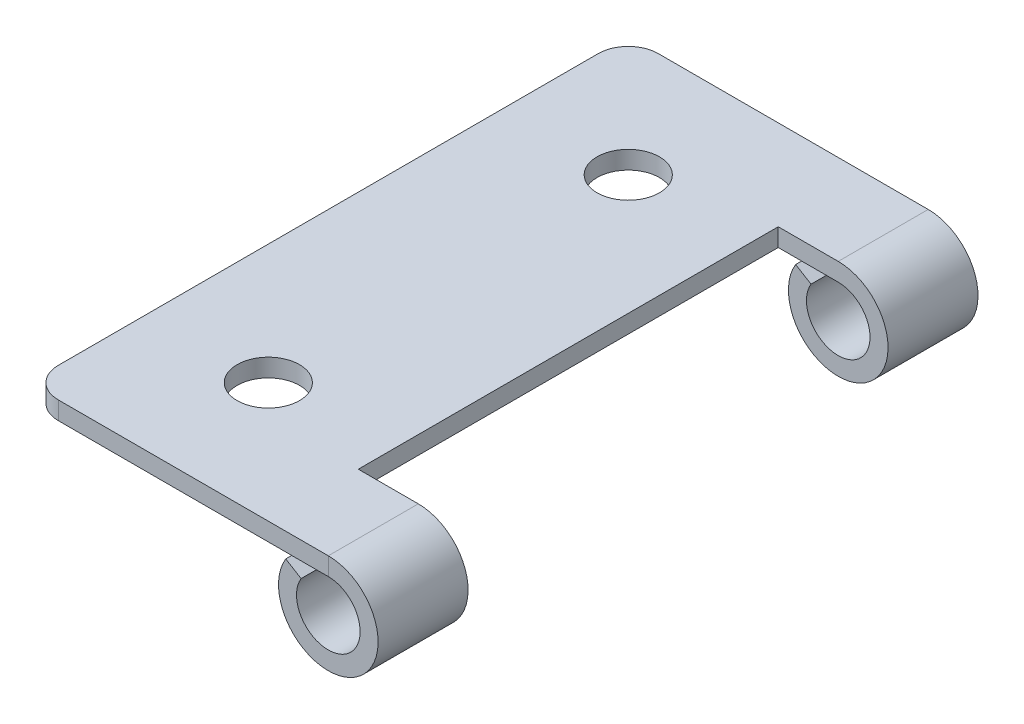
ISO-10303-21;
HEADER;
FILE_DESCRIPTION(('STEP AP214'),'2;1');
FILE_NAME('part.step','',(''),(''),'','','');
FILE_SCHEMA(('AUTOMOTIVE_DESIGN { 1 0 10303 214 1 1 1 1 }'));
ENDSEC;
DATA;
#1=APPLICATION_CONTEXT('core data for automotive mechanical design processes');
#2=APPLICATION_PROTOCOL_DEFINITION('international standard','automotive_design',2000,#1);
#3=PRODUCT_CONTEXT('',#1,'mechanical');
#4=PRODUCT('Part','Part','',(#3));
#5=PRODUCT_RELATED_PRODUCT_CATEGORY('part','',(#4));
#6=PRODUCT_DEFINITION_FORMATION('','',#4);
#7=PRODUCT_DEFINITION_CONTEXT('part definition',#1,'design');
#8=PRODUCT_DEFINITION('design','',#6,#7);
#9=PRODUCT_DEFINITION_SHAPE('','',#8);
#10=(LENGTH_UNIT() NAMED_UNIT(*) SI_UNIT(.MILLI.,.METRE.));
#11=(NAMED_UNIT(*) PLANE_ANGLE_UNIT() SI_UNIT($,.RADIAN.));
#12=(NAMED_UNIT(*) SI_UNIT($,.STERADIAN.) SOLID_ANGLE_UNIT());
#13=UNCERTAINTY_MEASURE_WITH_UNIT(LENGTH_MEASURE(1.E-05),#10,'distance_accuracy_value','');
#14=(GEOMETRIC_REPRESENTATION_CONTEXT(3) GLOBAL_UNCERTAINTY_ASSIGNED_CONTEXT((#13)) GLOBAL_UNIT_ASSIGNED_CONTEXT((#10,
#11,#12)) REPRESENTATION_CONTEXT('',''));
#15=CARTESIAN_POINT('',(0.,0.,0.));
#16=DIRECTION('',(0.,0.,1.));
#17=DIRECTION('',(1.,0.,0.));
#18=AXIS2_PLACEMENT_3D('',#15,#16,#17);
#19=CARTESIAN_POINT('',(12.5,-4.15,25.));
#20=DIRECTION('',(0.,0.,-1.));
#21=DIRECTION('',(-1.,0.,0.));
#22=AXIS2_PLACEMENT_3D('',#19,#20,#21);
#23=CYLINDRICAL_SURFACE('',#22,2.65);
#24=DIRECTION('',(0.,0.,-1.));
#25=VECTOR('',#24,1.);
#26=CARTESIAN_POINT('',(12.5,-1.5,25.));
#27=LINE('',#26,#25);
#28=CARTESIAN_POINT('',(12.5,-1.5,25.));
#29=VERTEX_POINT('',#28);
#30=CARTESIAN_POINT('',(12.5,-1.5,17.5));
#31=VERTEX_POINT('',#30);
#32=EDGE_CURVE('E211',#29,#31,#27,.T.);
#33=ORIENTED_EDGE('',*,*,#32,.T.);
#34=CARTESIAN_POINT('',(12.5,-4.15,17.5));
#35=DIRECTION('',(0.,0.,1.));
#36=DIRECTION('',(1.,0.,0.));
#37=AXIS2_PLACEMENT_3D('',#34,#35,#36);
#38=CIRCLE('',#37,2.65);
#39=CARTESIAN_POINT('',(10.2333573843064,-2.77710843373494,17.5));
#40=VERTEX_POINT('',#39);
#41=EDGE_CURVE('E178',#31,#40,#38,.F.);
#42=ORIENTED_EDGE('',*,*,#41,.T.);
#43=DIRECTION('',(0.,0.,-1.));
#44=VECTOR('',#43,1.);
#45=CARTESIAN_POINT('',(10.2333573843064,-2.77710843373494,25.));
#46=LINE('',#45,#44);
#47=CARTESIAN_POINT('',(10.2333573843064,-2.77710843373494,25.));
#48=VERTEX_POINT('',#47);
#49=EDGE_CURVE('E226',#48,#40,#46,.T.);
#50=ORIENTED_EDGE('',*,*,#49,.F.);
#51=CARTESIAN_POINT('',(12.5,-4.15,25.));
#52=DIRECTION('',(0.,0.,1.));
#53=DIRECTION('',(1.,0.,0.));
#54=AXIS2_PLACEMENT_3D('',#51,#52,#53);
#55=CIRCLE('',#54,2.65);
#56=EDGE_CURVE('E186',#29,#48,#55,.F.);
#57=ORIENTED_EDGE('',*,*,#56,.F.);
#58=EDGE_LOOP('',(#33,#42,#50,#57));
#59=FACE_BOUND('',#58,.T.);
#60=ADVANCED_FACE('F38',(#59),#23,.F.);
#61=CARTESIAN_POINT('',(8.95035213014023,-2.,25.));
#62=DIRECTION('',(0.518072289156626,0.855336836110788,0.));
#63=DIRECTION('',(-0.855336836110788,0.518072289156627,0.));
#64=AXIS2_PLACEMENT_3D('',#61,#62,#63);
#65=PLANE('',#64);
#66=DIRECTION('',(0.855336836110788,-0.518072289156627,0.));
#67=VECTOR('',#66,1.);
#68=CARTESIAN_POINT('',(8.95035213014023,-2.,17.5));
#69=LINE('',#68,#67);
#70=CARTESIAN_POINT('',(8.95035213014023,-2.,17.5));
#71=VERTEX_POINT('',#70);
#72=EDGE_CURVE('E181',#71,#40,#69,.T.);
#73=ORIENTED_EDGE('',*,*,#72,.F.);
#74=DIRECTION('',(0.,0.,-1.));
#75=VECTOR('',#74,1.);
#76=CARTESIAN_POINT('',(8.95035213014023,-2.,25.));
#77=LINE('',#76,#75);
#78=CARTESIAN_POINT('',(8.95035213014023,-2.,25.));
#79=VERTEX_POINT('',#78);
#80=EDGE_CURVE('E222',#79,#71,#77,.T.);
#81=ORIENTED_EDGE('',*,*,#80,.F.);
#82=DIRECTION('',(0.855336836110788,-0.518072289156627,0.));
#83=VECTOR('',#82,1.);
#84=CARTESIAN_POINT('',(8.95035213014023,-2.,25.));
#85=LINE('',#84,#83);
#86=EDGE_CURVE('E188',#79,#48,#85,.T.);
#87=ORIENTED_EDGE('',*,*,#86,.T.);
#88=ORIENTED_EDGE('',*,*,#49,.T.);
#89=EDGE_LOOP('',(#73,#81,#87,#88));
#90=FACE_BOUND('',#89,.T.);
#91=ADVANCED_FACE('F293',(#90),#65,.T.);
#92=CARTESIAN_POINT('',(12.5,-4.15,25.));
#93=DIRECTION('',(0.,0.,-1.));
#94=DIRECTION('',(-1.,0.,0.));
#95=AXIS2_PLACEMENT_3D('',#92,#93,#94);
#96=CYLINDRICAL_SURFACE('',#95,4.15);
#97=ORIENTED_EDGE('',*,*,#80,.T.);
#98=CARTESIAN_POINT('',(12.5,-4.15,17.5));
#99=DIRECTION('',(0.,0.,1.));
#100=DIRECTION('',(1.,0.,0.));
#101=AXIS2_PLACEMENT_3D('',#98,#99,#100);
#102=CIRCLE('',#101,4.15);
#103=CARTESIAN_POINT('',(12.5,0.,17.5));
#104=VERTEX_POINT('',#103);
#105=EDGE_CURVE('E183',#104,#71,#102,.F.);
#106=ORIENTED_EDGE('',*,*,#105,.F.);
#107=DIRECTION('',(0.,0.,-1.));
#108=VECTOR('',#107,1.);
#109=CARTESIAN_POINT('',(12.5,0.,25.));
#110=LINE('',#109,#108);
#111=CARTESIAN_POINT('',(12.5,0.,25.));
#112=VERTEX_POINT('',#111);
#113=EDGE_CURVE('E219',#112,#104,#110,.T.);
#114=ORIENTED_EDGE('',*,*,#113,.F.);
#115=CARTESIAN_POINT('',(12.5,-4.15,25.));
#116=DIRECTION('',(0.,0.,-1.));
#117=DIRECTION('',(-1.,0.,0.));
#118=AXIS2_PLACEMENT_3D('',#115,#116,#117);
#119=CIRCLE('',#118,4.15);
#120=EDGE_CURVE('E192',#112,#79,#119,.T.);
#121=ORIENTED_EDGE('',*,*,#120,.T.);
#122=EDGE_LOOP('',(#97,#106,#114,#121));
#123=FACE_BOUND('',#122,.T.);
#124=ADVANCED_FACE('F286',(#123),#96,.T.);
#125=CARTESIAN_POINT('',(12.5,-1.5,25.));
#126=DIRECTION('',(0.,0.,1.));
#127=DIRECTION('',(1.,0.,0.));
#128=AXIS2_PLACEMENT_3D('',#125,#126,#127);
#129=PLANE('',#128);
#130=DIRECTION('',(0.,1.,0.));
#131=VECTOR('',#130,1.);
#132=CARTESIAN_POINT('',(12.5,-1.5,25.));
#133=LINE('',#132,#131);
#134=EDGE_CURVE('E232',#29,#112,#133,.T.);
#135=ORIENTED_EDGE('',*,*,#134,.F.);
#136=ORIENTED_EDGE('',*,*,#56,.T.);
#137=ORIENTED_EDGE('',*,*,#86,.F.);
#138=ORIENTED_EDGE('',*,*,#120,.F.);
#139=EDGE_LOOP('',(#135,#136,#137,#138));
#140=FACE_BOUND('',#139,.T.);
#141=ADVANCED_FACE('F288',(#140),#129,.T.);
#142=CARTESIAN_POINT('',(12.5,0.,-25.));
#143=DIRECTION('',(0.,0.,-1.));
#144=DIRECTION('',(-1.,0.,0.));
#145=AXIS2_PLACEMENT_3D('',#142,#143,#144);
#146=PLANE('',#145);
#147=DIRECTION('',(0.,-1.,0.));
#148=VECTOR('',#147,1.);
#149=CARTESIAN_POINT('',(12.5,0.,-25.));
#150=LINE('',#149,#148);
#151=CARTESIAN_POINT('',(12.5,0.,-25.));
#152=VERTEX_POINT('',#151);
#153=CARTESIAN_POINT('',(12.5,-1.5,-25.));
#154=VERTEX_POINT('',#153);
#155=EDGE_CURVE('E229',#152,#154,#150,.T.);
#156=ORIENTED_EDGE('',*,*,#155,.F.);
#157=CARTESIAN_POINT('',(12.5,-4.15,-25.));
#158=DIRECTION('',(0.,0.,-1.));
#159=DIRECTION('',(-1.,0.,0.));
#160=AXIS2_PLACEMENT_3D('',#157,#158,#159);
#161=CIRCLE('',#160,4.15);
#162=CARTESIAN_POINT('',(8.95035213014023,-2.,-25.));
#163=VERTEX_POINT('',#162);
#164=EDGE_CURVE('E205',#152,#163,#161,.T.);
#165=ORIENTED_EDGE('',*,*,#164,.T.);
#166=DIRECTION('',(0.855336836110788,-0.518072289156627,0.));
#167=VECTOR('',#166,1.);
#168=CARTESIAN_POINT('',(8.95035213014023,-2.,-25.));
#169=LINE('',#168,#167);
#170=CARTESIAN_POINT('',(10.2333573843064,-2.77710843373494,-25.));
#171=VERTEX_POINT('',#170);
#172=EDGE_CURVE('E202',#163,#171,#169,.T.);
#173=ORIENTED_EDGE('',*,*,#172,.T.);
#174=CARTESIAN_POINT('',(12.5,-4.15,-25.));
#175=DIRECTION('',(0.,0.,1.));
#176=DIRECTION('',(1.,0.,0.));
#177=AXIS2_PLACEMENT_3D('',#174,#175,#176);
#178=CIRCLE('',#177,2.65);
#179=EDGE_CURVE('E185',#154,#171,#178,.F.);
#180=ORIENTED_EDGE('',*,*,#179,.F.);
#181=EDGE_LOOP('',(#156,#165,#173,#180));
#182=FACE_BOUND('',#181,.T.);
#183=ADVANCED_FACE('F309',(#182),#146,.T.);
#184=CARTESIAN_POINT('',(10.2333573843064,-2.77710843373494,-17.5));
#185=VERTEX_POINT('',#184);
#186=EDGE_CURVE('E225',#185,#171,#46,.T.);
#187=ORIENTED_EDGE('',*,*,#186,.F.);
#188=CARTESIAN_POINT('',(12.5,-4.15,-17.5));
#189=DIRECTION('',(0.,0.,-1.));
#190=DIRECTION('',(-1.,0.,0.));
#191=AXIS2_PLACEMENT_3D('',#188,#189,#190);
#192=CIRCLE('',#191,2.65);
#193=CARTESIAN_POINT('',(12.5,-1.5,-17.5));
#194=VERTEX_POINT('',#193);
#195=EDGE_CURVE('E171',#185,#194,#192,.F.);
#196=ORIENTED_EDGE('',*,*,#195,.T.);
#197=EDGE_CURVE('E199',#194,#154,#27,.T.);
#198=ORIENTED_EDGE('',*,*,#197,.T.);
#199=ORIENTED_EDGE('',*,*,#179,.T.);
#200=EDGE_LOOP('',(#187,#196,#198,#199));
#201=FACE_BOUND('',#200,.T.);
#202=ADVANCED_FACE('F300',(#201),#23,.F.);
#203=DIRECTION('',(-0.855336836110788,0.518072289156627,0.));
#204=VECTOR('',#203,1.);
#205=CARTESIAN_POINT('',(8.95035213014023,-2.,-17.5));
#206=LINE('',#205,#204);
#207=CARTESIAN_POINT('',(8.95035213014023,-2.,-17.5));
#208=VERTEX_POINT('',#207);
#209=EDGE_CURVE('E175',#185,#208,#206,.T.);
#210=ORIENTED_EDGE('',*,*,#209,.F.);
#211=ORIENTED_EDGE('',*,*,#186,.T.);
#212=ORIENTED_EDGE('',*,*,#172,.F.);
#213=EDGE_CURVE('E221',#208,#163,#77,.T.);
#214=ORIENTED_EDGE('',*,*,#213,.F.);
#215=EDGE_LOOP('',(#210,#211,#212,#214));
#216=FACE_BOUND('',#215,.T.);
#217=ADVANCED_FACE('F303',(#216),#65,.T.);
#218=CARTESIAN_POINT('',(12.5,-4.15,-17.5));
#219=DIRECTION('',(0.,0.,-1.));
#220=DIRECTION('',(-1.,0.,0.));
#221=AXIS2_PLACEMENT_3D('',#218,#219,#220);
#222=CIRCLE('',#221,4.15);
#223=CARTESIAN_POINT('',(12.5,0.,-17.5));
#224=VERTEX_POINT('',#223);
#225=EDGE_CURVE('E158',#208,#224,#222,.F.);
#226=ORIENTED_EDGE('',*,*,#225,.F.);
#227=ORIENTED_EDGE('',*,*,#213,.T.);
#228=ORIENTED_EDGE('',*,*,#164,.F.);
#229=EDGE_CURVE('E218',#224,#152,#110,.T.);
#230=ORIENTED_EDGE('',*,*,#229,.F.);
#231=EDGE_LOOP('',(#226,#227,#228,#230));
#232=FACE_BOUND('',#231,.T.);
#233=ADVANCED_FACE('F307',(#232),#96,.T.);
#234=CARTESIAN_POINT('',(-12.5,0.,25.));
#235=DIRECTION('',(0.,1.,0.));
#236=DIRECTION('',(-1.,0.,0.));
#237=AXIS2_PLACEMENT_3D('',#234,#235,#236);
#238=PLANE('',#237);
#239=CARTESIAN_POINT('',(-2.5,0.,15.));
#240=DIRECTION('',(0.,1.,0.));
#241=DIRECTION('',(-1.,0.,0.));
#242=AXIS2_PLACEMENT_3D('',#239,#240,#241);
#243=CIRCLE('',#242,2.6);
#244=CARTESIAN_POINT('',(-5.1,0.,15.));
#245=VERTEX_POINT('',#244);
#246=EDGE_CURVE('E248',#245,#245,#243,.T.);
#247=ORIENTED_EDGE('',*,*,#246,.F.);
#248=EDGE_LOOP('',(#247));
#249=FACE_BOUND('',#248,.T.);
#250=CARTESIAN_POINT('',(-2.5,0.,-15.));
#251=DIRECTION('',(0.,1.,0.));
#252=DIRECTION('',(-1.,0.,0.));
#253=AXIS2_PLACEMENT_3D('',#250,#251,#252);
#254=CIRCLE('',#253,2.6);
#255=CARTESIAN_POINT('',(-5.1,0.,-15.));
#256=VERTEX_POINT('',#255);
#257=EDGE_CURVE('E244',#256,#256,#254,.T.);
#258=ORIENTED_EDGE('',*,*,#257,.F.);
#259=EDGE_LOOP('',(#258));
#260=FACE_BOUND('',#259,.T.);
#261=DIRECTION('',(1.,0.,0.));
#262=VECTOR('',#261,1.);
#263=CARTESIAN_POINT('',(-12.5,0.,-25.));
#264=LINE('',#263,#262);
#265=CARTESIAN_POINT('',(-10.,0.,-25.));
#266=VERTEX_POINT('',#265);
#267=EDGE_CURVE('E208',#266,#152,#264,.T.);
#268=ORIENTED_EDGE('',*,*,#267,.F.);
#269=CARTESIAN_POINT('',(-10.,0.,-22.5));
#270=DIRECTION('',(0.,1.,0.));
#271=DIRECTION('',(-1.,0.,0.));
#272=AXIS2_PLACEMENT_3D('',#269,#270,#271);
#273=CIRCLE('',#272,2.5);
#274=CARTESIAN_POINT('',(-12.5,0.,-22.5));
#275=VERTEX_POINT('',#274);
#276=EDGE_CURVE('E253',#266,#275,#273,.T.);
#277=ORIENTED_EDGE('',*,*,#276,.T.);
#278=DIRECTION('',(0.,0.,-1.));
#279=VECTOR('',#278,1.);
#280=CARTESIAN_POINT('',(-12.5,0.,25.));
#281=LINE('',#280,#279);
#282=CARTESIAN_POINT('',(-12.5,0.,22.5));
#283=VERTEX_POINT('',#282);
#284=EDGE_CURVE('E216',#283,#275,#281,.T.);
#285=ORIENTED_EDGE('',*,*,#284,.F.);
#286=CARTESIAN_POINT('',(-10.,0.,22.5));
#287=DIRECTION('',(0.,1.,0.));
#288=DIRECTION('',(-1.,0.,0.));
#289=AXIS2_PLACEMENT_3D('',#286,#287,#288);
#290=CIRCLE('',#289,2.5);
#291=CARTESIAN_POINT('',(-10.,0.,25.));
#292=VERTEX_POINT('',#291);
#293=EDGE_CURVE('E251',#283,#292,#290,.T.);
#294=ORIENTED_EDGE('',*,*,#293,.T.);
#295=DIRECTION('',(1.,0.,0.));
#296=VECTOR('',#295,1.);
#297=CARTESIAN_POINT('',(-12.5,0.,25.));
#298=LINE('',#297,#296);
#299=EDGE_CURVE('E195',#292,#112,#298,.T.);
#300=ORIENTED_EDGE('',*,*,#299,.T.);
#301=ORIENTED_EDGE('',*,*,#113,.T.);
#302=DIRECTION('',(1.,0.,0.));
#303=VECTOR('',#302,1.);
#304=CARTESIAN_POINT('',(16.65,0.,17.5));
#305=LINE('',#304,#303);
#306=CARTESIAN_POINT('',(7.5,0.,17.5));
#307=VERTEX_POINT('',#306);
#308=EDGE_CURVE('E152',#307,#104,#305,.T.);
#309=ORIENTED_EDGE('',*,*,#308,.F.);
#310=DIRECTION('',(0.,0.,1.));
#311=VECTOR('',#310,1.);
#312=CARTESIAN_POINT('',(7.5,0.,-17.5));
#313=LINE('',#312,#311);
#314=CARTESIAN_POINT('',(7.5,0.,-17.5));
#315=VERTEX_POINT('',#314);
#316=EDGE_CURVE('E145',#315,#307,#313,.T.);
#317=ORIENTED_EDGE('',*,*,#316,.F.);
#318=DIRECTION('',(-1.,0.,0.));
#319=VECTOR('',#318,1.);
#320=CARTESIAN_POINT('',(16.65,0.,-17.5));
#321=LINE('',#320,#319);
#322=EDGE_CURVE('E155',#224,#315,#321,.T.);
#323=ORIENTED_EDGE('',*,*,#322,.F.);
#324=ORIENTED_EDGE('',*,*,#229,.T.);
#325=EDGE_LOOP('',(#268,#277,#285,#294,#300,#301,#309,#317,#323,#324));
#326=FACE_BOUND('',#325,.T.);
#327=ADVANCED_FACE('F165',(#249,#260,#326),#238,.T.);
#328=CARTESIAN_POINT('',(-12.5,-1.5,25.));
#329=DIRECTION('',(-1.,0.,0.));
#330=DIRECTION('',(0.,0.,1.));
#331=AXIS2_PLACEMENT_3D('',#328,#329,#330);
#332=PLANE('',#331);
#333=ORIENTED_EDGE('',*,*,#284,.T.);
#334=DIRECTION('',(0.,1.,0.));
#335=VECTOR('',#334,1.);
#336=CARTESIAN_POINT('',(-12.5,-1.5,-22.5));
#337=LINE('',#336,#335);
#338=CARTESIAN_POINT('',(-12.5,-1.5,-22.5));
#339=VERTEX_POINT('',#338);
#340=EDGE_CURVE('E59',#275,#339,#337,.F.);
#341=ORIENTED_EDGE('',*,*,#340,.T.);
#342=DIRECTION('',(0.,0.,-1.));
#343=VECTOR('',#342,1.);
#344=CARTESIAN_POINT('',(-12.5,-1.5,25.));
#345=LINE('',#344,#343);
#346=CARTESIAN_POINT('',(-12.5,-1.5,22.5));
#347=VERTEX_POINT('',#346);
#348=EDGE_CURVE('E214',#347,#339,#345,.T.);
#349=ORIENTED_EDGE('',*,*,#348,.F.);
#350=DIRECTION('',(0.,1.,0.));
#351=VECTOR('',#350,1.);
#352=CARTESIAN_POINT('',(-12.5,-1.5,22.5));
#353=LINE('',#352,#351);
#354=EDGE_CURVE('E255',#347,#283,#353,.T.);
#355=ORIENTED_EDGE('',*,*,#354,.T.);
#356=EDGE_LOOP('',(#333,#341,#349,#355));
#357=FACE_BOUND('',#356,.T.);
#358=ADVANCED_FACE('F274',(#357),#332,.T.);
#359=CARTESIAN_POINT('',(-12.5,-1.5,25.));
#360=DIRECTION('',(0.,1.,0.));
#361=DIRECTION('',(-1.,0.,0.));
#362=AXIS2_PLACEMENT_3D('',#359,#360,#361);
#363=PLANE('',#362);
#364=CARTESIAN_POINT('',(-2.5,-1.5,15.));
#365=DIRECTION('',(0.,1.,0.));
#366=DIRECTION('',(-1.,0.,0.));
#367=AXIS2_PLACEMENT_3D('',#364,#365,#366);
#368=CIRCLE('',#367,2.6);
#369=CARTESIAN_POINT('',(-5.1,-1.5,15.));
#370=VERTEX_POINT('',#369);
#371=EDGE_CURVE('E245',#370,#370,#368,.T.);
#372=ORIENTED_EDGE('',*,*,#371,.T.);
#373=EDGE_LOOP('',(#372));
#374=FACE_BOUND('',#373,.T.);
#375=CARTESIAN_POINT('',(-2.5,-1.5,-15.));
#376=DIRECTION('',(0.,1.,0.));
#377=DIRECTION('',(-1.,0.,0.));
#378=AXIS2_PLACEMENT_3D('',#375,#376,#377);
#379=CIRCLE('',#378,2.6);
#380=CARTESIAN_POINT('',(-5.1,-1.5,-15.));
#381=VERTEX_POINT('',#380);
#382=EDGE_CURVE('E162',#381,#381,#379,.T.);
#383=ORIENTED_EDGE('',*,*,#382,.T.);
#384=EDGE_LOOP('',(#383));
#385=FACE_BOUND('',#384,.T.);
#386=ORIENTED_EDGE('',*,*,#348,.T.);
#387=CARTESIAN_POINT('',(-10.,-1.5,-22.5));
#388=DIRECTION('',(0.,1.,0.));
#389=DIRECTION('',(-1.,0.,0.));
#390=AXIS2_PLACEMENT_3D('',#387,#388,#389);
#391=CIRCLE('',#390,2.5);
#392=CARTESIAN_POINT('',(-10.,-1.5,-25.));
#393=VERTEX_POINT('',#392);
#394=EDGE_CURVE('E46',#339,#393,#391,.F.);
#395=ORIENTED_EDGE('',*,*,#394,.T.);
#396=DIRECTION('',(1.,0.,0.));
#397=VECTOR('',#396,1.);
#398=CARTESIAN_POINT('',(-12.5,-1.5,-25.));
#399=LINE('',#398,#397);
#400=EDGE_CURVE('E189',#393,#154,#399,.T.);
#401=ORIENTED_EDGE('',*,*,#400,.T.);
#402=ORIENTED_EDGE('',*,*,#197,.F.);
#403=DIRECTION('',(-1.,0.,0.));
#404=VECTOR('',#403,1.);
#405=CARTESIAN_POINT('',(-12.5,-1.5,-17.5));
#406=LINE('',#405,#404);
#407=CARTESIAN_POINT('',(7.5,-1.5,-17.5));
#408=VERTEX_POINT('',#407);
#409=EDGE_CURVE('E235',#194,#408,#406,.T.);
#410=ORIENTED_EDGE('',*,*,#409,.T.);
#411=DIRECTION('',(0.,0.,1.));
#412=VECTOR('',#411,1.);
#413=CARTESIAN_POINT('',(7.50000000000001,-1.5,25.));
#414=LINE('',#413,#412);
#415=CARTESIAN_POINT('',(7.5,-1.5,17.5));
#416=VERTEX_POINT('',#415);
#417=EDGE_CURVE('E148',#408,#416,#414,.T.);
#418=ORIENTED_EDGE('',*,*,#417,.T.);
#419=DIRECTION('',(1.,0.,0.));
#420=VECTOR('',#419,1.);
#421=CARTESIAN_POINT('',(-12.5,-1.5,17.5));
#422=LINE('',#421,#420);
#423=EDGE_CURVE('E238',#416,#31,#422,.T.);
#424=ORIENTED_EDGE('',*,*,#423,.T.);
#425=ORIENTED_EDGE('',*,*,#32,.F.);
#426=DIRECTION('',(1.,0.,0.));
#427=VECTOR('',#426,1.);
#428=CARTESIAN_POINT('',(-12.5,-1.5,25.));
#429=LINE('',#428,#427);
#430=CARTESIAN_POINT('',(-10.,-1.5,25.));
#431=VERTEX_POINT('',#430);
#432=EDGE_CURVE('E197',#431,#29,#429,.T.);
#433=ORIENTED_EDGE('',*,*,#432,.F.);
#434=CARTESIAN_POINT('',(-10.,-1.5,22.5));
#435=DIRECTION('',(0.,1.,0.));
#436=DIRECTION('',(-1.,0.,0.));
#437=AXIS2_PLACEMENT_3D('',#434,#435,#436);
#438=CIRCLE('',#437,2.5);
#439=EDGE_CURVE('E259',#431,#347,#438,.F.);
#440=ORIENTED_EDGE('',*,*,#439,.T.);
#441=EDGE_LOOP('',(#386,#395,#401,#402,#410,#418,#424,#425,#433,#440));
#442=FACE_BOUND('',#441,.T.);
#443=ADVANCED_FACE('F263',(#374,#385,#442),#363,.F.);
#444=CARTESIAN_POINT('',(12.5,-4.15,25.));
#445=DIRECTION('',(0.,0.,1.));
#446=DIRECTION('',(1.,0.,0.));
#447=AXIS2_PLACEMENT_3D('',#444,#445,#446);
#448=PLANE('',#447);
#449=ORIENTED_EDGE('',*,*,#299,.F.);
#450=DIRECTION('',(0.,1.,0.));
#451=VECTOR('',#450,1.);
#452=CARTESIAN_POINT('',(-10.,-4.15,25.));
#453=LINE('',#452,#451);
#454=EDGE_CURVE('E11',#292,#431,#453,.F.);
#455=ORIENTED_EDGE('',*,*,#454,.T.);
#456=ORIENTED_EDGE('',*,*,#432,.T.);
#457=ORIENTED_EDGE('',*,*,#134,.T.);
#458=EDGE_LOOP('',(#449,#455,#456,#457));
#459=FACE_BOUND('',#458,.T.);
#460=ADVANCED_FACE('F278',(#459),#448,.T.);
#461=CARTESIAN_POINT('',(12.5,-4.15,-25.));
#462=DIRECTION('',(0.,0.,1.));
#463=DIRECTION('',(1.,0.,0.));
#464=AXIS2_PLACEMENT_3D('',#461,#462,#463);
#465=PLANE('',#464);
#466=ORIENTED_EDGE('',*,*,#400,.F.);
#467=DIRECTION('',(0.,1.,0.));
#468=VECTOR('',#467,1.);
#469=CARTESIAN_POINT('',(-10.,0.,-25.));
#470=LINE('',#469,#468);
#471=EDGE_CURVE('E241',#393,#266,#470,.T.);
#472=ORIENTED_EDGE('',*,*,#471,.T.);
#473=ORIENTED_EDGE('',*,*,#267,.T.);
#474=ORIENTED_EDGE('',*,*,#155,.T.);
#475=EDGE_LOOP('',(#466,#472,#473,#474));
#476=FACE_BOUND('',#475,.T.);
#477=ADVANCED_FACE('F269',(#476),#465,.F.);
#478=CARTESIAN_POINT('',(7.5,-8.3,-17.5));
#479=DIRECTION('',(-1.,0.,0.));
#480=DIRECTION('',(0.,0.,1.));
#481=AXIS2_PLACEMENT_3D('',#478,#479,#480);
#482=PLANE('',#481);
#483=DIRECTION('',(0.,1.,0.));
#484=VECTOR('',#483,1.);
#485=CARTESIAN_POINT('',(7.5,-8.3,-17.5));
#486=LINE('',#485,#484);
#487=EDGE_CURVE('E140',#408,#315,#486,.T.);
#488=ORIENTED_EDGE('',*,*,#487,.T.);
#489=ORIENTED_EDGE('',*,*,#316,.T.);
#490=DIRECTION('',(0.,1.,0.));
#491=VECTOR('',#490,1.);
#492=CARTESIAN_POINT('',(7.5,-8.3,17.5));
#493=LINE('',#492,#491);
#494=EDGE_CURVE('E151',#416,#307,#493,.T.);
#495=ORIENTED_EDGE('',*,*,#494,.F.);
#496=ORIENTED_EDGE('',*,*,#417,.F.);
#497=EDGE_LOOP('',(#488,#489,#495,#496));
#498=FACE_BOUND('',#497,.T.);
#499=ADVANCED_FACE('F142',(#498),#482,.F.);
#500=CARTESIAN_POINT('',(16.65,-8.3,17.5));
#501=DIRECTION('',(0.,0.,1.));
#502=DIRECTION('',(1.,0.,0.));
#503=AXIS2_PLACEMENT_3D('',#500,#501,#502);
#504=PLANE('',#503);
#505=ORIENTED_EDGE('',*,*,#105,.T.);
#506=ORIENTED_EDGE('',*,*,#72,.T.);
#507=ORIENTED_EDGE('',*,*,#41,.F.);
#508=ORIENTED_EDGE('',*,*,#423,.F.);
#509=ORIENTED_EDGE('',*,*,#494,.T.);
#510=ORIENTED_EDGE('',*,*,#308,.T.);
#511=EDGE_LOOP('',(#505,#506,#507,#508,#509,#510));
#512=FACE_BOUND('',#511,.T.);
#513=ADVANCED_FACE('F295',(#512),#504,.F.);
#514=CARTESIAN_POINT('',(16.65,-8.3,-17.5));
#515=DIRECTION('',(0.,0.,-1.));
#516=DIRECTION('',(-1.,0.,0.));
#517=AXIS2_PLACEMENT_3D('',#514,#515,#516);
#518=PLANE('',#517);
#519=ORIENTED_EDGE('',*,*,#225,.T.);
#520=ORIENTED_EDGE('',*,*,#322,.T.);
#521=ORIENTED_EDGE('',*,*,#487,.F.);
#522=ORIENTED_EDGE('',*,*,#409,.F.);
#523=ORIENTED_EDGE('',*,*,#195,.F.);
#524=ORIENTED_EDGE('',*,*,#209,.T.);
#525=EDGE_LOOP('',(#519,#520,#521,#522,#523,#524));
#526=FACE_BOUND('',#525,.T.);
#527=ADVANCED_FACE('F156',(#526),#518,.F.);
#528=CARTESIAN_POINT('',(-2.5,-10.,-15.));
#529=DIRECTION('',(0.,1.,0.));
#530=DIRECTION('',(-1.,0.,0.));
#531=AXIS2_PLACEMENT_3D('',#528,#529,#530);
#532=CYLINDRICAL_SURFACE('',#531,2.6);
#533=ORIENTED_EDGE('',*,*,#257,.T.);
#534=EDGE_LOOP('',(#533));
#535=FACE_BOUND('',#534,.T.);
#536=ORIENTED_EDGE('',*,*,#382,.F.);
#537=EDGE_LOOP('',(#536));
#538=FACE_BOUND('',#537,.T.);
#539=ADVANCED_FACE('F341',(#535,#538),#532,.F.);
#540=CARTESIAN_POINT('',(-2.5,-10.,15.));
#541=DIRECTION('',(0.,1.,0.));
#542=DIRECTION('',(-1.,0.,0.));
#543=AXIS2_PLACEMENT_3D('',#540,#541,#542);
#544=CYLINDRICAL_SURFACE('',#543,2.6);
#545=ORIENTED_EDGE('',*,*,#246,.T.);
#546=EDGE_LOOP('',(#545));
#547=FACE_BOUND('',#546,.T.);
#548=ORIENTED_EDGE('',*,*,#371,.F.);
#549=EDGE_LOOP('',(#548));
#550=FACE_BOUND('',#549,.T.);
#551=ADVANCED_FACE('F348',(#547,#550),#544,.F.);
#552=CARTESIAN_POINT('',(-10.,-4.15,-22.5));
#553=DIRECTION('',(0.,-1.,0.));
#554=DIRECTION('',(0.,0.,-1.));
#555=AXIS2_PLACEMENT_3D('',#552,#553,#554);
#556=CYLINDRICAL_SURFACE('',#555,2.5);
#557=ORIENTED_EDGE('',*,*,#394,.F.);
#558=ORIENTED_EDGE('',*,*,#340,.F.);
#559=ORIENTED_EDGE('',*,*,#276,.F.);
#560=ORIENTED_EDGE('',*,*,#471,.F.);
#561=EDGE_LOOP('',(#557,#558,#559,#560));
#562=FACE_BOUND('',#561,.T.);
#563=ADVANCED_FACE('F272',(#562),#556,.T.);
#564=CARTESIAN_POINT('',(-10.,-1.5,22.5));
#565=DIRECTION('',(0.,1.,0.));
#566=DIRECTION('',(0.,0.,1.));
#567=AXIS2_PLACEMENT_3D('',#564,#565,#566);
#568=CYLINDRICAL_SURFACE('',#567,2.5);
#569=ORIENTED_EDGE('',*,*,#439,.F.);
#570=ORIENTED_EDGE('',*,*,#454,.F.);
#571=ORIENTED_EDGE('',*,*,#293,.F.);
#572=ORIENTED_EDGE('',*,*,#354,.F.);
#573=EDGE_LOOP('',(#569,#570,#571,#572));
#574=FACE_BOUND('',#573,.T.);
#575=ADVANCED_FACE('F40',(#574),#568,.T.);
#576=CLOSED_SHELL('',(#60,#91,#124,#141,#183,#202,#217,#233,#327,#358,#443,#460,#477,#499,#513,
#527,#539,#551,#563,#575));
#577=MANIFOLD_SOLID_BREP('B2',#576);
#578=ADVANCED_BREP_SHAPE_REPRESENTATION('',(#18,#577),#14);
#579=SHAPE_DEFINITION_REPRESENTATION(#9,#578);
ENDSEC;
END-ISO-10303-21;
